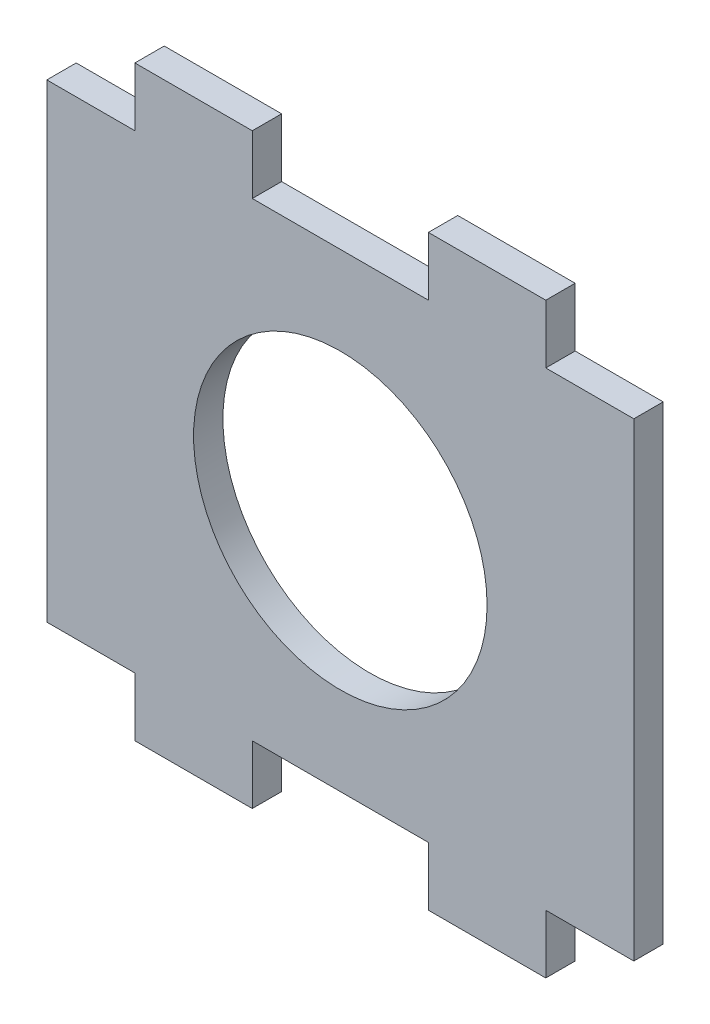
ISO-10303-21;
HEADER;
FILE_DESCRIPTION(('STEP AP214'),'2;1');
FILE_NAME('part.step','',(''),(''),'','','');
FILE_SCHEMA(('AUTOMOTIVE_DESIGN { 1 0 10303 214 1 1 1 1 }'));
ENDSEC;
DATA;
#1=APPLICATION_CONTEXT('core data for automotive mechanical design processes');
#2=APPLICATION_PROTOCOL_DEFINITION('international standard','automotive_design',2000,#1);
#3=PRODUCT_CONTEXT('',#1,'mechanical');
#4=PRODUCT('Part','Part','',(#3));
#5=PRODUCT_RELATED_PRODUCT_CATEGORY('part','',(#4));
#6=PRODUCT_DEFINITION_FORMATION('','',#4);
#7=PRODUCT_DEFINITION_CONTEXT('part definition',#1,'design');
#8=PRODUCT_DEFINITION('design','',#6,#7);
#9=PRODUCT_DEFINITION_SHAPE('','',#8);
#10=(LENGTH_UNIT() NAMED_UNIT(*) SI_UNIT(.MILLI.,.METRE.));
#11=(NAMED_UNIT(*) PLANE_ANGLE_UNIT() SI_UNIT($,.RADIAN.));
#12=(NAMED_UNIT(*) SI_UNIT($,.STERADIAN.) SOLID_ANGLE_UNIT());
#13=UNCERTAINTY_MEASURE_WITH_UNIT(LENGTH_MEASURE(1.E-05),#10,'distance_accuracy_value','');
#14=(GEOMETRIC_REPRESENTATION_CONTEXT(3) GLOBAL_UNCERTAINTY_ASSIGNED_CONTEXT((#13)) GLOBAL_UNIT_ASSIGNED_CONTEXT((#10,
#11,#12)) REPRESENTATION_CONTEXT('',''));
#15=CARTESIAN_POINT('',(0.,0.,0.));
#16=DIRECTION('',(0.,0.,1.));
#17=DIRECTION('',(1.,0.,0.));
#18=AXIS2_PLACEMENT_3D('',#15,#16,#17);
#19=CARTESIAN_POINT('',(-22.225,0.,3.175));
#20=DIRECTION('',(-1.,0.,0.));
#21=DIRECTION('',(0.,0.,1.));
#22=AXIS2_PLACEMENT_3D('',#19,#20,#21);
#23=PLANE('',#22);
#24=DIRECTION('',(0.,1.,0.));
#25=VECTOR('',#24,1.);
#26=CARTESIAN_POINT('',(-22.225,0.,0.));
#27=LINE('',#26,#25);
#28=CARTESIAN_POINT('',(-22.225,25.4,0.));
#29=VERTEX_POINT('',#28);
#30=CARTESIAN_POINT('',(-22.225,31.75,0.));
#31=VERTEX_POINT('',#30);
#32=EDGE_CURVE('E208',#29,#31,#27,.T.);
#33=ORIENTED_EDGE('',*,*,#32,.F.);
#34=DIRECTION('',(0.,0.,-1.));
#35=VECTOR('',#34,1.);
#36=CARTESIAN_POINT('',(-22.225,25.4,3.175));
#37=LINE('',#36,#35);
#38=CARTESIAN_POINT('',(-22.225,25.4,3.175));
#39=VERTEX_POINT('',#38);
#40=EDGE_CURVE('E11',#39,#29,#37,.T.);
#41=ORIENTED_EDGE('',*,*,#40,.F.);
#42=DIRECTION('',(0.,1.,0.));
#43=VECTOR('',#42,1.);
#44=CARTESIAN_POINT('',(-22.225,0.,3.175));
#45=LINE('',#44,#43);
#46=CARTESIAN_POINT('',(-22.225,31.75,3.175));
#47=VERTEX_POINT('',#46);
#48=EDGE_CURVE('E257',#39,#47,#45,.T.);
#49=ORIENTED_EDGE('',*,*,#48,.T.);
#50=DIRECTION('',(0.,0.,-1.));
#51=VECTOR('',#50,1.);
#52=CARTESIAN_POINT('',(-22.225,31.75,3.175));
#53=LINE('',#52,#51);
#54=EDGE_CURVE('E51',#47,#31,#53,.T.);
#55=ORIENTED_EDGE('',*,*,#54,.T.);
#56=EDGE_LOOP('',(#33,#41,#49,#55));
#57=FACE_BOUND('',#56,.T.);
#58=ADVANCED_FACE('F35',(#57),#23,.T.);
#59=CARTESIAN_POINT('',(0.,25.4,3.175));
#60=DIRECTION('',(0.,-1.,0.));
#61=DIRECTION('',(1.,0.,0.));
#62=AXIS2_PLACEMENT_3D('',#59,#60,#61);
#63=PLANE('',#62);
#64=DIRECTION('',(-1.,0.,0.));
#65=VECTOR('',#64,1.);
#66=CARTESIAN_POINT('',(0.,25.4,0.));
#67=LINE('',#66,#65);
#68=CARTESIAN_POINT('',(-31.75,25.4,0.));
#69=VERTEX_POINT('',#68);
#70=EDGE_CURVE('E210',#29,#69,#67,.T.);
#71=ORIENTED_EDGE('',*,*,#70,.T.);
#72=DIRECTION('',(0.,0.,-1.));
#73=VECTOR('',#72,1.);
#74=CARTESIAN_POINT('',(-31.75,25.4,3.175));
#75=LINE('',#74,#73);
#76=CARTESIAN_POINT('',(-31.75,25.4,3.175));
#77=VERTEX_POINT('',#76);
#78=EDGE_CURVE('E43',#77,#69,#75,.T.);
#79=ORIENTED_EDGE('',*,*,#78,.F.);
#80=DIRECTION('',(-1.,0.,0.));
#81=VECTOR('',#80,1.);
#82=CARTESIAN_POINT('',(0.,25.4,3.175));
#83=LINE('',#82,#81);
#84=EDGE_CURVE('E188',#39,#77,#83,.T.);
#85=ORIENTED_EDGE('',*,*,#84,.F.);
#86=ORIENTED_EDGE('',*,*,#40,.T.);
#87=EDGE_LOOP('',(#71,#79,#85,#86));
#88=FACE_BOUND('',#87,.T.);
#89=ADVANCED_FACE('F301',(#88),#63,.F.);
#90=CARTESIAN_POINT('',(-31.75,0.,3.175));
#91=DIRECTION('',(-1.,0.,0.));
#92=DIRECTION('',(0.,0.,1.));
#93=AXIS2_PLACEMENT_3D('',#90,#91,#92);
#94=PLANE('',#93);
#95=DIRECTION('',(0.,1.,0.));
#96=VECTOR('',#95,1.);
#97=CARTESIAN_POINT('',(-31.75,0.,0.));
#98=LINE('',#97,#96);
#99=CARTESIAN_POINT('',(-31.75,-25.4,0.));
#100=VERTEX_POINT('',#99);
#101=EDGE_CURVE('E213',#100,#69,#98,.T.);
#102=ORIENTED_EDGE('',*,*,#101,.F.);
#103=DIRECTION('',(0.,0.,-1.));
#104=VECTOR('',#103,1.);
#105=CARTESIAN_POINT('',(-31.75,-25.4,3.175));
#106=LINE('',#105,#104);
#107=CARTESIAN_POINT('',(-31.75,-25.4,3.175));
#108=VERTEX_POINT('',#107);
#109=EDGE_CURVE('E291',#108,#100,#106,.T.);
#110=ORIENTED_EDGE('',*,*,#109,.F.);
#111=DIRECTION('',(0.,1.,0.));
#112=VECTOR('',#111,1.);
#113=CARTESIAN_POINT('',(-31.75,0.,3.175));
#114=LINE('',#113,#112);
#115=EDGE_CURVE('E298',#108,#77,#114,.T.);
#116=ORIENTED_EDGE('',*,*,#115,.T.);
#117=ORIENTED_EDGE('',*,*,#78,.T.);
#118=EDGE_LOOP('',(#102,#110,#116,#117));
#119=FACE_BOUND('',#118,.T.);
#120=ADVANCED_FACE('F296',(#119),#94,.T.);
#121=CARTESIAN_POINT('',(0.,-25.4,3.175));
#122=DIRECTION('',(0.,-1.,0.));
#123=DIRECTION('',(1.,0.,0.));
#124=AXIS2_PLACEMENT_3D('',#121,#122,#123);
#125=PLANE('',#124);
#126=DIRECTION('',(-1.,0.,0.));
#127=VECTOR('',#126,1.);
#128=CARTESIAN_POINT('',(0.,-25.4,0.));
#129=LINE('',#128,#127);
#130=CARTESIAN_POINT('',(-22.225,-25.4,0.));
#131=VERTEX_POINT('',#130);
#132=EDGE_CURVE('E217',#131,#100,#129,.T.);
#133=ORIENTED_EDGE('',*,*,#132,.F.);
#134=DIRECTION('',(0.,0.,-1.));
#135=VECTOR('',#134,1.);
#136=CARTESIAN_POINT('',(-22.225,-25.4,3.175));
#137=LINE('',#136,#135);
#138=CARTESIAN_POINT('',(-22.225,-25.4,3.175));
#139=VERTEX_POINT('',#138);
#140=EDGE_CURVE('E289',#139,#131,#137,.T.);
#141=ORIENTED_EDGE('',*,*,#140,.F.);
#142=DIRECTION('',(-1.,0.,0.));
#143=VECTOR('',#142,1.);
#144=CARTESIAN_POINT('',(0.,-25.4,3.175));
#145=LINE('',#144,#143);
#146=EDGE_CURVE('E313',#139,#108,#145,.T.);
#147=ORIENTED_EDGE('',*,*,#146,.T.);
#148=ORIENTED_EDGE('',*,*,#109,.T.);
#149=EDGE_LOOP('',(#133,#141,#147,#148));
#150=FACE_BOUND('',#149,.T.);
#151=ADVANCED_FACE('F309',(#150),#125,.T.);
#152=CARTESIAN_POINT('',(-22.225,0.,3.175));
#153=DIRECTION('',(1.,0.,0.));
#154=DIRECTION('',(0.,0.,-1.));
#155=AXIS2_PLACEMENT_3D('',#152,#153,#154);
#156=PLANE('',#155);
#157=DIRECTION('',(0.,-1.,0.));
#158=VECTOR('',#157,1.);
#159=CARTESIAN_POINT('',(-22.225,0.,0.));
#160=LINE('',#159,#158);
#161=CARTESIAN_POINT('',(-22.225,-31.75,0.));
#162=VERTEX_POINT('',#161);
#163=EDGE_CURVE('E220',#131,#162,#160,.T.);
#164=ORIENTED_EDGE('',*,*,#163,.T.);
#165=DIRECTION('',(0.,0.,-1.));
#166=VECTOR('',#165,1.);
#167=CARTESIAN_POINT('',(-22.225,-31.75,3.175));
#168=LINE('',#167,#166);
#169=CARTESIAN_POINT('',(-22.225,-31.75,3.175));
#170=VERTEX_POINT('',#169);
#171=EDGE_CURVE('E286',#170,#162,#168,.T.);
#172=ORIENTED_EDGE('',*,*,#171,.F.);
#173=DIRECTION('',(0.,-1.,0.));
#174=VECTOR('',#173,1.);
#175=CARTESIAN_POINT('',(-22.225,0.,3.175));
#176=LINE('',#175,#174);
#177=EDGE_CURVE('E315',#139,#170,#176,.T.);
#178=ORIENTED_EDGE('',*,*,#177,.F.);
#179=ORIENTED_EDGE('',*,*,#140,.T.);
#180=EDGE_LOOP('',(#164,#172,#178,#179));
#181=FACE_BOUND('',#180,.T.);
#182=ADVANCED_FACE('F387',(#181),#156,.F.);
#183=CARTESIAN_POINT('',(0.,-31.75,3.175));
#184=DIRECTION('',(0.,1.,0.));
#185=DIRECTION('',(0.,0.,1.));
#186=AXIS2_PLACEMENT_3D('',#183,#184,#185);
#187=PLANE('',#186);
#188=DIRECTION('',(1.,0.,0.));
#189=VECTOR('',#188,1.);
#190=CARTESIAN_POINT('',(0.,-31.75,0.));
#191=LINE('',#190,#189);
#192=CARTESIAN_POINT('',(-9.525,-31.75,0.));
#193=VERTEX_POINT('',#192);
#194=EDGE_CURVE('E224',#162,#193,#191,.T.);
#195=ORIENTED_EDGE('',*,*,#194,.T.);
#196=DIRECTION('',(0.,0.,-1.));
#197=VECTOR('',#196,1.);
#198=CARTESIAN_POINT('',(-9.525,-31.75,3.175));
#199=LINE('',#198,#197);
#200=CARTESIAN_POINT('',(-9.525,-31.75,3.175));
#201=VERTEX_POINT('',#200);
#202=EDGE_CURVE('E284',#201,#193,#199,.T.);
#203=ORIENTED_EDGE('',*,*,#202,.F.);
#204=DIRECTION('',(1.,0.,0.));
#205=VECTOR('',#204,1.);
#206=CARTESIAN_POINT('',(0.,-31.75,3.175));
#207=LINE('',#206,#205);
#208=EDGE_CURVE('E322',#170,#201,#207,.T.);
#209=ORIENTED_EDGE('',*,*,#208,.F.);
#210=ORIENTED_EDGE('',*,*,#171,.T.);
#211=EDGE_LOOP('',(#195,#203,#209,#210));
#212=FACE_BOUND('',#211,.T.);
#213=ADVANCED_FACE('F384',(#212),#187,.F.);
#214=CARTESIAN_POINT('',(-9.525,0.,3.175));
#215=DIRECTION('',(1.,0.,0.));
#216=DIRECTION('',(0.,0.,-1.));
#217=AXIS2_PLACEMENT_3D('',#214,#215,#216);
#218=PLANE('',#217);
#219=DIRECTION('',(0.,-1.,0.));
#220=VECTOR('',#219,1.);
#221=CARTESIAN_POINT('',(-9.525,0.,0.));
#222=LINE('',#221,#220);
#223=CARTESIAN_POINT('',(-9.525,-25.4,0.));
#224=VERTEX_POINT('',#223);
#225=EDGE_CURVE('E227',#224,#193,#222,.T.);
#226=ORIENTED_EDGE('',*,*,#225,.F.);
#227=DIRECTION('',(0.,0.,-1.));
#228=VECTOR('',#227,1.);
#229=CARTESIAN_POINT('',(-9.525,-25.4,3.175));
#230=LINE('',#229,#228);
#231=CARTESIAN_POINT('',(-9.525,-25.4,3.175));
#232=VERTEX_POINT('',#231);
#233=EDGE_CURVE('E282',#232,#224,#230,.T.);
#234=ORIENTED_EDGE('',*,*,#233,.F.);
#235=DIRECTION('',(0.,-1.,0.));
#236=VECTOR('',#235,1.);
#237=CARTESIAN_POINT('',(-9.525,0.,3.175));
#238=LINE('',#237,#236);
#239=EDGE_CURVE('E324',#232,#201,#238,.T.);
#240=ORIENTED_EDGE('',*,*,#239,.T.);
#241=ORIENTED_EDGE('',*,*,#202,.T.);
#242=EDGE_LOOP('',(#226,#234,#240,#241));
#243=FACE_BOUND('',#242,.T.);
#244=ADVANCED_FACE('F380',(#243),#218,.T.);
#245=CARTESIAN_POINT('',(9.525,-25.4,0.));
#246=VERTEX_POINT('',#245);
#247=EDGE_CURVE('E222',#246,#224,#129,.T.);
#248=ORIENTED_EDGE('',*,*,#247,.F.);
#249=DIRECTION('',(0.,0.,-1.));
#250=VECTOR('',#249,1.);
#251=CARTESIAN_POINT('',(9.525,-25.4,3.175));
#252=LINE('',#251,#250);
#253=CARTESIAN_POINT('',(9.525,-25.4,3.175));
#254=VERTEX_POINT('',#253);
#255=EDGE_CURVE('E280',#254,#246,#252,.T.);
#256=ORIENTED_EDGE('',*,*,#255,.F.);
#257=EDGE_CURVE('E318',#254,#232,#145,.T.);
#258=ORIENTED_EDGE('',*,*,#257,.T.);
#259=ORIENTED_EDGE('',*,*,#233,.T.);
#260=EDGE_LOOP('',(#248,#256,#258,#259));
#261=FACE_BOUND('',#260,.T.);
#262=ADVANCED_FACE('F374',(#261),#125,.T.);
#263=CARTESIAN_POINT('',(9.525,0.,3.175));
#264=DIRECTION('',(1.,0.,0.));
#265=DIRECTION('',(0.,0.,-1.));
#266=AXIS2_PLACEMENT_3D('',#263,#264,#265);
#267=PLANE('',#266);
#268=DIRECTION('',(0.,-1.,0.));
#269=VECTOR('',#268,1.);
#270=CARTESIAN_POINT('',(9.525,0.,0.));
#271=LINE('',#270,#269);
#272=CARTESIAN_POINT('',(9.525,-31.75,0.));
#273=VERTEX_POINT('',#272);
#274=EDGE_CURVE('E230',#246,#273,#271,.T.);
#275=ORIENTED_EDGE('',*,*,#274,.T.);
#276=DIRECTION('',(0.,0.,-1.));
#277=VECTOR('',#276,1.);
#278=CARTESIAN_POINT('',(9.525,-31.75,3.175));
#279=LINE('',#278,#277);
#280=CARTESIAN_POINT('',(9.525,-31.75,3.175));
#281=VERTEX_POINT('',#280);
#282=EDGE_CURVE('E277',#281,#273,#279,.T.);
#283=ORIENTED_EDGE('',*,*,#282,.F.);
#284=DIRECTION('',(0.,-1.,0.));
#285=VECTOR('',#284,1.);
#286=CARTESIAN_POINT('',(9.525,0.,3.175));
#287=LINE('',#286,#285);
#288=EDGE_CURVE('E327',#254,#281,#287,.T.);
#289=ORIENTED_EDGE('',*,*,#288,.F.);
#290=ORIENTED_EDGE('',*,*,#255,.T.);
#291=EDGE_LOOP('',(#275,#283,#289,#290));
#292=FACE_BOUND('',#291,.T.);
#293=ADVANCED_FACE('F392',(#292),#267,.F.);
#294=CARTESIAN_POINT('',(0.,-31.75,3.175));
#295=DIRECTION('',(0.,1.,0.));
#296=DIRECTION('',(0.,0.,1.));
#297=AXIS2_PLACEMENT_3D('',#294,#295,#296);
#298=PLANE('',#297);
#299=DIRECTION('',(1.,0.,0.));
#300=VECTOR('',#299,1.);
#301=CARTESIAN_POINT('',(0.,-31.75,0.));
#302=LINE('',#301,#300);
#303=CARTESIAN_POINT('',(22.225,-31.75,0.));
#304=VERTEX_POINT('',#303);
#305=EDGE_CURVE('E232',#273,#304,#302,.T.);
#306=ORIENTED_EDGE('',*,*,#305,.T.);
#307=DIRECTION('',(0.,0.,-1.));
#308=VECTOR('',#307,1.);
#309=CARTESIAN_POINT('',(22.225,-31.75,3.175));
#310=LINE('',#309,#308);
#311=CARTESIAN_POINT('',(22.225,-31.75,3.175));
#312=VERTEX_POINT('',#311);
#313=EDGE_CURVE('E275',#312,#304,#310,.T.);
#314=ORIENTED_EDGE('',*,*,#313,.F.);
#315=DIRECTION('',(1.,0.,0.));
#316=VECTOR('',#315,1.);
#317=CARTESIAN_POINT('',(0.,-31.75,3.175));
#318=LINE('',#317,#316);
#319=EDGE_CURVE('E329',#281,#312,#318,.T.);
#320=ORIENTED_EDGE('',*,*,#319,.F.);
#321=ORIENTED_EDGE('',*,*,#282,.T.);
#322=EDGE_LOOP('',(#306,#314,#320,#321));
#323=FACE_BOUND('',#322,.T.);
#324=ADVANCED_FACE('F394',(#323),#298,.F.);
#325=CARTESIAN_POINT('',(22.225,0.,3.175));
#326=DIRECTION('',(1.,0.,0.));
#327=DIRECTION('',(0.,0.,-1.));
#328=AXIS2_PLACEMENT_3D('',#325,#326,#327);
#329=PLANE('',#328);
#330=DIRECTION('',(0.,-1.,0.));
#331=VECTOR('',#330,1.);
#332=CARTESIAN_POINT('',(22.225,0.,0.));
#333=LINE('',#332,#331);
#334=CARTESIAN_POINT('',(22.225,-25.4,0.));
#335=VERTEX_POINT('',#334);
#336=EDGE_CURVE('E235',#335,#304,#333,.T.);
#337=ORIENTED_EDGE('',*,*,#336,.F.);
#338=DIRECTION('',(0.,0.,-1.));
#339=VECTOR('',#338,1.);
#340=CARTESIAN_POINT('',(22.225,-25.4,3.175));
#341=LINE('',#340,#339);
#342=CARTESIAN_POINT('',(22.225,-25.4,3.175));
#343=VERTEX_POINT('',#342);
#344=EDGE_CURVE('E273',#343,#335,#341,.T.);
#345=ORIENTED_EDGE('',*,*,#344,.F.);
#346=DIRECTION('',(0.,-1.,0.));
#347=VECTOR('',#346,1.);
#348=CARTESIAN_POINT('',(22.225,0.,3.175));
#349=LINE('',#348,#347);
#350=EDGE_CURVE('E331',#343,#312,#349,.T.);
#351=ORIENTED_EDGE('',*,*,#350,.T.);
#352=ORIENTED_EDGE('',*,*,#313,.T.);
#353=EDGE_LOOP('',(#337,#345,#351,#352));
#354=FACE_BOUND('',#353,.T.);
#355=ADVANCED_FACE('F396',(#354),#329,.T.);
#356=CARTESIAN_POINT('',(31.75,-25.4,0.));
#357=VERTEX_POINT('',#356);
#358=EDGE_CURVE('E221',#357,#335,#129,.T.);
#359=ORIENTED_EDGE('',*,*,#358,.F.);
#360=DIRECTION('',(0.,0.,-1.));
#361=VECTOR('',#360,1.);
#362=CARTESIAN_POINT('',(31.75,-25.4,3.175));
#363=LINE('',#362,#361);
#364=CARTESIAN_POINT('',(31.75,-25.4,3.175));
#365=VERTEX_POINT('',#364);
#366=EDGE_CURVE('E271',#365,#357,#363,.T.);
#367=ORIENTED_EDGE('',*,*,#366,.F.);
#368=EDGE_CURVE('E317',#365,#343,#145,.T.);
#369=ORIENTED_EDGE('',*,*,#368,.T.);
#370=ORIENTED_EDGE('',*,*,#344,.T.);
#371=EDGE_LOOP('',(#359,#367,#369,#370));
#372=FACE_BOUND('',#371,.T.);
#373=ADVANCED_FACE('F366',(#372),#125,.T.);
#374=CARTESIAN_POINT('',(31.75,0.,3.175));
#375=DIRECTION('',(-1.,0.,0.));
#376=DIRECTION('',(0.,0.,1.));
#377=AXIS2_PLACEMENT_3D('',#374,#375,#376);
#378=PLANE('',#377);
#379=DIRECTION('',(0.,1.,0.));
#380=VECTOR('',#379,1.);
#381=CARTESIAN_POINT('',(31.75,0.,0.));
#382=LINE('',#381,#380);
#383=CARTESIAN_POINT('',(31.75,25.4,0.));
#384=VERTEX_POINT('',#383);
#385=EDGE_CURVE('E238',#357,#384,#382,.T.);
#386=ORIENTED_EDGE('',*,*,#385,.T.);
#387=DIRECTION('',(0.,0.,-1.));
#388=VECTOR('',#387,1.);
#389=CARTESIAN_POINT('',(31.75,25.4,3.175));
#390=LINE('',#389,#388);
#391=CARTESIAN_POINT('',(31.75,25.4,3.175));
#392=VERTEX_POINT('',#391);
#393=EDGE_CURVE('E268',#392,#384,#390,.T.);
#394=ORIENTED_EDGE('',*,*,#393,.F.);
#395=DIRECTION('',(0.,1.,0.));
#396=VECTOR('',#395,1.);
#397=CARTESIAN_POINT('',(31.75,0.,3.175));
#398=LINE('',#397,#396);
#399=EDGE_CURVE('E334',#365,#392,#398,.T.);
#400=ORIENTED_EDGE('',*,*,#399,.F.);
#401=ORIENTED_EDGE('',*,*,#366,.T.);
#402=EDGE_LOOP('',(#386,#394,#400,#401));
#403=FACE_BOUND('',#402,.T.);
#404=ADVANCED_FACE('F362',(#403),#378,.F.);
#405=CARTESIAN_POINT('',(22.225,25.4,0.));
#406=VERTEX_POINT('',#405);
#407=EDGE_CURVE('E214',#384,#406,#67,.T.);
#408=ORIENTED_EDGE('',*,*,#407,.T.);
#409=DIRECTION('',(0.,0.,-1.));
#410=VECTOR('',#409,1.);
#411=CARTESIAN_POINT('',(22.225,25.4,3.175));
#412=LINE('',#411,#410);
#413=CARTESIAN_POINT('',(22.225,25.4,3.175));
#414=VERTEX_POINT('',#413);
#415=EDGE_CURVE('E265',#414,#406,#412,.T.);
#416=ORIENTED_EDGE('',*,*,#415,.F.);
#417=EDGE_CURVE('E187',#392,#414,#83,.T.);
#418=ORIENTED_EDGE('',*,*,#417,.F.);
#419=ORIENTED_EDGE('',*,*,#393,.T.);
#420=EDGE_LOOP('',(#408,#416,#418,#419));
#421=FACE_BOUND('',#420,.T.);
#422=ADVANCED_FACE('F347',(#421),#63,.F.);
#423=CARTESIAN_POINT('',(22.225,0.,3.175));
#424=DIRECTION('',(-1.,0.,0.));
#425=DIRECTION('',(0.,0.,1.));
#426=AXIS2_PLACEMENT_3D('',#423,#424,#425);
#427=PLANE('',#426);
#428=DIRECTION('',(0.,1.,0.));
#429=VECTOR('',#428,1.);
#430=CARTESIAN_POINT('',(22.225,0.,0.));
#431=LINE('',#430,#429);
#432=CARTESIAN_POINT('',(22.225,31.75,0.));
#433=VERTEX_POINT('',#432);
#434=EDGE_CURVE('E240',#406,#433,#431,.T.);
#435=ORIENTED_EDGE('',*,*,#434,.T.);
#436=DIRECTION('',(0.,0.,-1.));
#437=VECTOR('',#436,1.);
#438=CARTESIAN_POINT('',(22.225,31.75,3.175));
#439=LINE('',#438,#437);
#440=CARTESIAN_POINT('',(22.225,31.75,3.175));
#441=VERTEX_POINT('',#440);
#442=EDGE_CURVE('E263',#441,#433,#439,.T.);
#443=ORIENTED_EDGE('',*,*,#442,.F.);
#444=DIRECTION('',(0.,1.,0.));
#445=VECTOR('',#444,1.);
#446=CARTESIAN_POINT('',(22.225,0.,3.175));
#447=LINE('',#446,#445);
#448=EDGE_CURVE('E336',#414,#441,#447,.T.);
#449=ORIENTED_EDGE('',*,*,#448,.F.);
#450=ORIENTED_EDGE('',*,*,#415,.T.);
#451=EDGE_LOOP('',(#435,#443,#449,#450));
#452=FACE_BOUND('',#451,.T.);
#453=ADVANCED_FACE('F354',(#452),#427,.F.);
#454=CARTESIAN_POINT('',(0.,31.75,3.175));
#455=DIRECTION('',(0.,1.,0.));
#456=DIRECTION('',(0.,0.,1.));
#457=AXIS2_PLACEMENT_3D('',#454,#455,#456);
#458=PLANE('',#457);
#459=DIRECTION('',(1.,0.,0.));
#460=VECTOR('',#459,1.);
#461=CARTESIAN_POINT('',(0.,31.75,0.));
#462=LINE('',#461,#460);
#463=CARTESIAN_POINT('',(9.525,31.75,0.));
#464=VERTEX_POINT('',#463);
#465=EDGE_CURVE('E243',#464,#433,#462,.T.);
#466=ORIENTED_EDGE('',*,*,#465,.F.);
#467=DIRECTION('',(0.,0.,-1.));
#468=VECTOR('',#467,1.);
#469=CARTESIAN_POINT('',(9.525,31.75,3.175));
#470=LINE('',#469,#468);
#471=CARTESIAN_POINT('',(9.525,31.75,3.175));
#472=VERTEX_POINT('',#471);
#473=EDGE_CURVE('E261',#472,#464,#470,.T.);
#474=ORIENTED_EDGE('',*,*,#473,.F.);
#475=DIRECTION('',(1.,0.,0.));
#476=VECTOR('',#475,1.);
#477=CARTESIAN_POINT('',(0.,31.75,3.175));
#478=LINE('',#477,#476);
#479=EDGE_CURVE('E337',#472,#441,#478,.T.);
#480=ORIENTED_EDGE('',*,*,#479,.T.);
#481=ORIENTED_EDGE('',*,*,#442,.T.);
#482=EDGE_LOOP('',(#466,#474,#480,#481));
#483=FACE_BOUND('',#482,.T.);
#484=ADVANCED_FACE('F356',(#483),#458,.T.);
#485=CARTESIAN_POINT('',(9.525,0.,3.175));
#486=DIRECTION('',(-1.,0.,0.));
#487=DIRECTION('',(0.,0.,1.));
#488=AXIS2_PLACEMENT_3D('',#485,#486,#487);
#489=PLANE('',#488);
#490=DIRECTION('',(0.,1.,0.));
#491=VECTOR('',#490,1.);
#492=CARTESIAN_POINT('',(9.525,0.,0.));
#493=LINE('',#492,#491);
#494=CARTESIAN_POINT('',(9.525,25.4,0.));
#495=VERTEX_POINT('',#494);
#496=EDGE_CURVE('E246',#495,#464,#493,.T.);
#497=ORIENTED_EDGE('',*,*,#496,.F.);
#498=DIRECTION('',(0.,0.,-1.));
#499=VECTOR('',#498,1.);
#500=CARTESIAN_POINT('',(9.525,25.4,3.175));
#501=LINE('',#500,#499);
#502=CARTESIAN_POINT('',(9.525,25.4,3.175));
#503=VERTEX_POINT('',#502);
#504=EDGE_CURVE('E196',#503,#495,#501,.T.);
#505=ORIENTED_EDGE('',*,*,#504,.F.);
#506=DIRECTION('',(0.,1.,0.));
#507=VECTOR('',#506,1.);
#508=CARTESIAN_POINT('',(9.525,0.,3.175));
#509=LINE('',#508,#507);
#510=EDGE_CURVE('E184',#503,#472,#509,.T.);
#511=ORIENTED_EDGE('',*,*,#510,.T.);
#512=ORIENTED_EDGE('',*,*,#473,.T.);
#513=EDGE_LOOP('',(#497,#505,#511,#512));
#514=FACE_BOUND('',#513,.T.);
#515=ADVANCED_FACE('F342',(#514),#489,.T.);
#516=CARTESIAN_POINT('',(-9.525,25.4,0.));
#517=VERTEX_POINT('',#516);
#518=EDGE_CURVE('E193',#495,#517,#67,.T.);
#519=ORIENTED_EDGE('',*,*,#518,.T.);
#520=DIRECTION('',(0.,0.,-1.));
#521=VECTOR('',#520,1.);
#522=CARTESIAN_POINT('',(-9.525,25.4,3.175));
#523=LINE('',#522,#521);
#524=CARTESIAN_POINT('',(-9.525,25.4,3.175));
#525=VERTEX_POINT('',#524);
#526=EDGE_CURVE('E190',#525,#517,#523,.T.);
#527=ORIENTED_EDGE('',*,*,#526,.F.);
#528=EDGE_CURVE('E174',#503,#525,#83,.T.);
#529=ORIENTED_EDGE('',*,*,#528,.F.);
#530=ORIENTED_EDGE('',*,*,#504,.T.);
#531=EDGE_LOOP('',(#519,#527,#529,#530));
#532=FACE_BOUND('',#531,.T.);
#533=ADVANCED_FACE('F191',(#532),#63,.F.);
#534=CARTESIAN_POINT('',(-9.525,0.,3.175));
#535=DIRECTION('',(-1.,0.,0.));
#536=DIRECTION('',(0.,0.,1.));
#537=AXIS2_PLACEMENT_3D('',#534,#535,#536);
#538=PLANE('',#537);
#539=DIRECTION('',(0.,1.,0.));
#540=VECTOR('',#539,1.);
#541=CARTESIAN_POINT('',(-9.525,0.,0.));
#542=LINE('',#541,#540);
#543=CARTESIAN_POINT('',(-9.525,31.75,0.));
#544=VERTEX_POINT('',#543);
#545=EDGE_CURVE('E249',#517,#544,#542,.T.);
#546=ORIENTED_EDGE('',*,*,#545,.T.);
#547=DIRECTION('',(0.,0.,-1.));
#548=VECTOR('',#547,1.);
#549=CARTESIAN_POINT('',(-9.525,31.75,3.175));
#550=LINE('',#549,#548);
#551=CARTESIAN_POINT('',(-9.525,31.75,3.175));
#552=VERTEX_POINT('',#551);
#553=EDGE_CURVE('E113',#552,#544,#550,.T.);
#554=ORIENTED_EDGE('',*,*,#553,.F.);
#555=DIRECTION('',(0.,1.,0.));
#556=VECTOR('',#555,1.);
#557=CARTESIAN_POINT('',(-9.525,0.,3.175));
#558=LINE('',#557,#556);
#559=EDGE_CURVE('E181',#525,#552,#558,.T.);
#560=ORIENTED_EDGE('',*,*,#559,.F.);
#561=ORIENTED_EDGE('',*,*,#526,.T.);
#562=EDGE_LOOP('',(#546,#554,#560,#561));
#563=FACE_BOUND('',#562,.T.);
#564=ADVANCED_FACE('F198',(#563),#538,.F.);
#565=CARTESIAN_POINT('',(0.,31.75,3.175));
#566=DIRECTION('',(0.,1.,0.));
#567=DIRECTION('',(0.,0.,1.));
#568=AXIS2_PLACEMENT_3D('',#565,#566,#567);
#569=PLANE('',#568);
#570=DIRECTION('',(1.,0.,0.));
#571=VECTOR('',#570,1.);
#572=CARTESIAN_POINT('',(0.,31.75,0.));
#573=LINE('',#572,#571);
#574=EDGE_CURVE('E251',#31,#544,#573,.T.);
#575=ORIENTED_EDGE('',*,*,#574,.F.);
#576=ORIENTED_EDGE('',*,*,#54,.F.);
#577=DIRECTION('',(1.,0.,0.));
#578=VECTOR('',#577,1.);
#579=CARTESIAN_POINT('',(0.,31.75,3.175));
#580=LINE('',#579,#578);
#581=EDGE_CURVE('E199',#47,#552,#580,.T.);
#582=ORIENTED_EDGE('',*,*,#581,.T.);
#583=ORIENTED_EDGE('',*,*,#553,.T.);
#584=EDGE_LOOP('',(#575,#576,#582,#583));
#585=FACE_BOUND('',#584,.T.);
#586=ADVANCED_FACE('F410',(#585),#569,.T.);
#587=CARTESIAN_POINT('',(0.,0.,3.175));
#588=DIRECTION('',(0.,0.,-1.));
#589=DIRECTION('',(-1.,0.,0.));
#590=AXIS2_PLACEMENT_3D('',#587,#588,#589);
#591=CYLINDRICAL_SURFACE('',#590,15.875);
#592=CARTESIAN_POINT('',(0.,0.,3.175));
#593=DIRECTION('',(0.,0.,1.));
#594=DIRECTION('',(1.,0.,0.));
#595=AXIS2_PLACEMENT_3D('',#592,#593,#594);
#596=CIRCLE('',#595,15.875);
#597=CARTESIAN_POINT('',(15.875,0.,3.175));
#598=VERTEX_POINT('',#597);
#599=EDGE_CURVE('E201',#598,#598,#596,.T.);
#600=ORIENTED_EDGE('',*,*,#599,.T.);
#601=EDGE_LOOP('',(#600));
#602=FACE_BOUND('',#601,.T.);
#603=CARTESIAN_POINT('',(0.,0.,0.));
#604=DIRECTION('',(0.,0.,1.));
#605=DIRECTION('',(1.,0.,0.));
#606=AXIS2_PLACEMENT_3D('',#603,#604,#605);
#607=CIRCLE('',#606,15.875);
#608=CARTESIAN_POINT('',(15.875,0.,0.));
#609=VERTEX_POINT('',#608);
#610=EDGE_CURVE('E254',#609,#609,#607,.T.);
#611=ORIENTED_EDGE('',*,*,#610,.F.);
#612=EDGE_LOOP('',(#611));
#613=FACE_BOUND('',#612,.T.);
#614=ADVANCED_FACE('F412',(#602,#613),#591,.F.);
#615=CARTESIAN_POINT('',(0.,0.,3.175));
#616=DIRECTION('',(0.,0.,1.));
#617=DIRECTION('',(1.,0.,0.));
#618=AXIS2_PLACEMENT_3D('',#615,#616,#617);
#619=PLANE('',#618);
#620=ORIENTED_EDGE('',*,*,#48,.F.);
#621=ORIENTED_EDGE('',*,*,#84,.T.);
#622=ORIENTED_EDGE('',*,*,#115,.F.);
#623=ORIENTED_EDGE('',*,*,#146,.F.);
#624=ORIENTED_EDGE('',*,*,#177,.T.);
#625=ORIENTED_EDGE('',*,*,#208,.T.);
#626=ORIENTED_EDGE('',*,*,#239,.F.);
#627=ORIENTED_EDGE('',*,*,#257,.F.);
#628=ORIENTED_EDGE('',*,*,#288,.T.);
#629=ORIENTED_EDGE('',*,*,#319,.T.);
#630=ORIENTED_EDGE('',*,*,#350,.F.);
#631=ORIENTED_EDGE('',*,*,#368,.F.);
#632=ORIENTED_EDGE('',*,*,#399,.T.);
#633=ORIENTED_EDGE('',*,*,#417,.T.);
#634=ORIENTED_EDGE('',*,*,#448,.T.);
#635=ORIENTED_EDGE('',*,*,#479,.F.);
#636=ORIENTED_EDGE('',*,*,#510,.F.);
#637=ORIENTED_EDGE('',*,*,#528,.T.);
#638=ORIENTED_EDGE('',*,*,#559,.T.);
#639=ORIENTED_EDGE('',*,*,#581,.F.);
#640=EDGE_LOOP('',(#620,#621,#622,#623,#624,#625,#626,#627,#628,#629,#630,#631,#632,#633,#634,
#635,#636,#637,#638,#639));
#641=FACE_BOUND('',#640,.T.);
#642=ORIENTED_EDGE('',*,*,#599,.F.);
#643=EDGE_LOOP('',(#642));
#644=FACE_BOUND('',#643,.T.);
#645=ADVANCED_FACE('F177',(#641,#644),#619,.T.);
#646=CARTESIAN_POINT('',(0.,0.,0.));
#647=DIRECTION('',(0.,0.,1.));
#648=DIRECTION('',(1.,0.,0.));
#649=AXIS2_PLACEMENT_3D('',#646,#647,#648);
#650=PLANE('',#649);
#651=ORIENTED_EDGE('',*,*,#32,.T.);
#652=ORIENTED_EDGE('',*,*,#574,.T.);
#653=ORIENTED_EDGE('',*,*,#545,.F.);
#654=ORIENTED_EDGE('',*,*,#518,.F.);
#655=ORIENTED_EDGE('',*,*,#496,.T.);
#656=ORIENTED_EDGE('',*,*,#465,.T.);
#657=ORIENTED_EDGE('',*,*,#434,.F.);
#658=ORIENTED_EDGE('',*,*,#407,.F.);
#659=ORIENTED_EDGE('',*,*,#385,.F.);
#660=ORIENTED_EDGE('',*,*,#358,.T.);
#661=ORIENTED_EDGE('',*,*,#336,.T.);
#662=ORIENTED_EDGE('',*,*,#305,.F.);
#663=ORIENTED_EDGE('',*,*,#274,.F.);
#664=ORIENTED_EDGE('',*,*,#247,.T.);
#665=ORIENTED_EDGE('',*,*,#225,.T.);
#666=ORIENTED_EDGE('',*,*,#194,.F.);
#667=ORIENTED_EDGE('',*,*,#163,.F.);
#668=ORIENTED_EDGE('',*,*,#132,.T.);
#669=ORIENTED_EDGE('',*,*,#101,.T.);
#670=ORIENTED_EDGE('',*,*,#70,.F.);
#671=EDGE_LOOP('',(#651,#652,#653,#654,#655,#656,#657,#658,#659,#660,#661,#662,#663,#664,#665,
#666,#667,#668,#669,#670));
#672=FACE_BOUND('',#671,.T.);
#673=ORIENTED_EDGE('',*,*,#610,.T.);
#674=EDGE_LOOP('',(#673));
#675=FACE_BOUND('',#674,.T.);
#676=ADVANCED_FACE('F303',(#672,#675),#650,.F.);
#677=CLOSED_SHELL('',(#58,#89,#120,#151,#182,#213,#244,#262,#293,#324,#355,#373,#404,#422,#453,
#484,#515,#533,#564,#586,#614,#645,#676));
#678=MANIFOLD_SOLID_BREP('B2',#677);
#679=ADVANCED_BREP_SHAPE_REPRESENTATION('',(#18,#678),#14);
#680=SHAPE_DEFINITION_REPRESENTATION(#9,#679);
ENDSEC;
END-ISO-10303-21;
